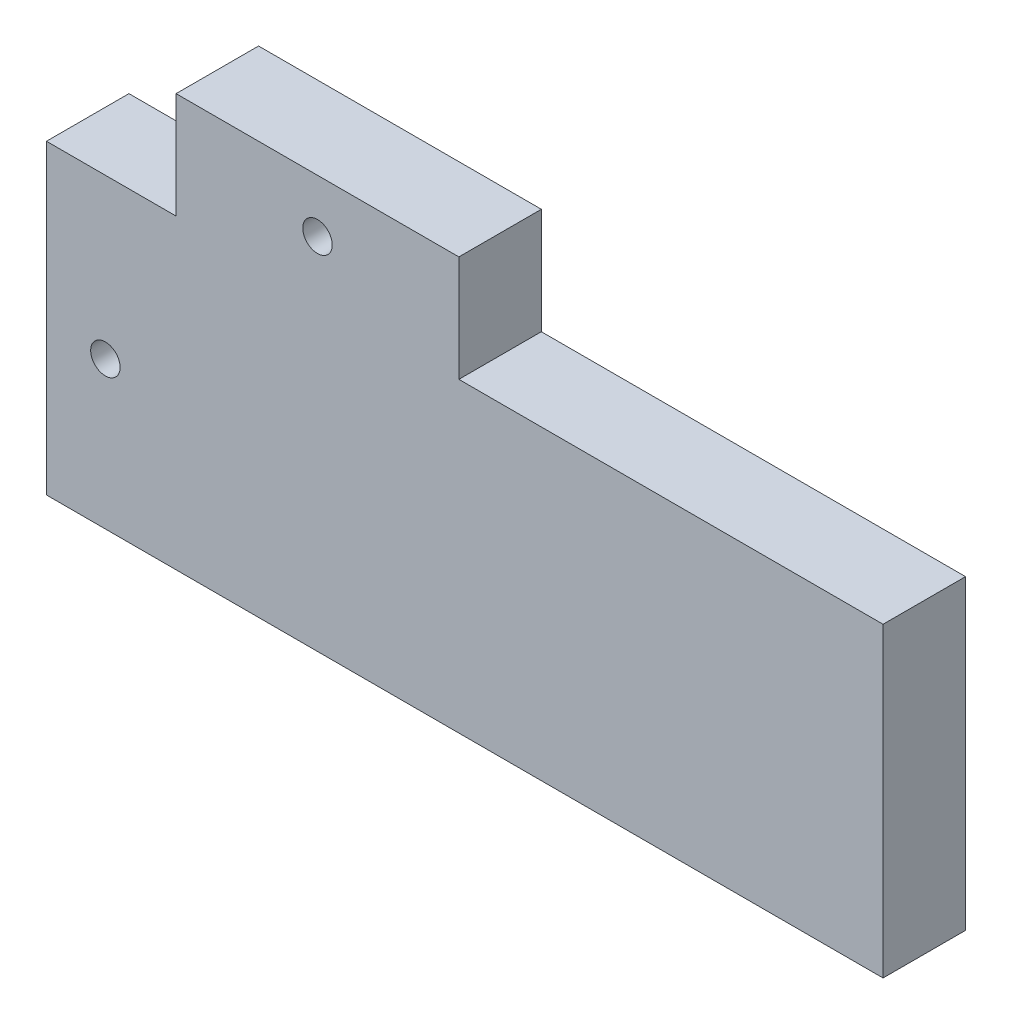
ISO-10303-21;
HEADER;
FILE_DESCRIPTION(('STEP AP214'),'2;1');
FILE_NAME('part.step','',(''),(''),'','','');
FILE_SCHEMA(('AUTOMOTIVE_DESIGN { 1 0 10303 214 1 1 1 1 }'));
ENDSEC;
DATA;
#1=APPLICATION_CONTEXT('core data for automotive mechanical design processes');
#2=APPLICATION_PROTOCOL_DEFINITION('international standard','automotive_design',2000,#1);
#3=PRODUCT_CONTEXT('',#1,'mechanical');
#4=PRODUCT('Part','Part','',(#3));
#5=PRODUCT_RELATED_PRODUCT_CATEGORY('part','',(#4));
#6=PRODUCT_DEFINITION_FORMATION('','',#4);
#7=PRODUCT_DEFINITION_CONTEXT('part definition',#1,'design');
#8=PRODUCT_DEFINITION('design','',#6,#7);
#9=PRODUCT_DEFINITION_SHAPE('','',#8);
#10=(LENGTH_UNIT() NAMED_UNIT(*) SI_UNIT(.MILLI.,.METRE.));
#11=(NAMED_UNIT(*) PLANE_ANGLE_UNIT() SI_UNIT($,.RADIAN.));
#12=(NAMED_UNIT(*) SI_UNIT($,.STERADIAN.) SOLID_ANGLE_UNIT());
#13=UNCERTAINTY_MEASURE_WITH_UNIT(LENGTH_MEASURE(1.E-05),#10,'distance_accuracy_value','');
#14=(GEOMETRIC_REPRESENTATION_CONTEXT(3) GLOBAL_UNCERTAINTY_ASSIGNED_CONTEXT((#13)) GLOBAL_UNIT_ASSIGNED_CONTEXT((#10,
#11,#12)) REPRESENTATION_CONTEXT('',''));
#15=CARTESIAN_POINT('',(0.,0.,0.));
#16=DIRECTION('',(0.,0.,1.));
#17=DIRECTION('',(1.,0.,0.));
#18=AXIS2_PLACEMENT_3D('',#15,#16,#17);
#19=CARTESIAN_POINT('',(0.,-13.,7.));
#20=DIRECTION('',(0.,1.,0.));
#21=DIRECTION('',(0.,0.,1.));
#22=AXIS2_PLACEMENT_3D('',#19,#20,#21);
#23=PLANE('',#22);
#24=DIRECTION('',(1.,0.,0.));
#25=VECTOR('',#24,1.);
#26=CARTESIAN_POINT('',(0.,-13.,0.));
#27=LINE('',#26,#25);
#28=CARTESIAN_POINT('',(-28.,-13.,0.));
#29=VERTEX_POINT('',#28);
#30=CARTESIAN_POINT('',(43.,-13.,0.));
#31=VERTEX_POINT('',#30);
#32=EDGE_CURVE('E149',#29,#31,#27,.T.);
#33=ORIENTED_EDGE('',*,*,#32,.T.);
#34=DIRECTION('',(0.,0.,-1.));
#35=VECTOR('',#34,1.);
#36=CARTESIAN_POINT('',(43.,-13.,7.));
#37=LINE('',#36,#35);
#38=CARTESIAN_POINT('',(43.,-13.,7.));
#39=VERTEX_POINT('',#38);
#40=EDGE_CURVE('E166',#39,#31,#37,.T.);
#41=ORIENTED_EDGE('',*,*,#40,.F.);
#42=DIRECTION('',(1.,0.,0.));
#43=VECTOR('',#42,1.);
#44=CARTESIAN_POINT('',(0.,-13.,7.));
#45=LINE('',#44,#43);
#46=CARTESIAN_POINT('',(-28.,-13.,7.));
#47=VERTEX_POINT('',#46);
#48=EDGE_CURVE('E124',#47,#39,#45,.T.);
#49=ORIENTED_EDGE('',*,*,#48,.F.);
#50=DIRECTION('',(0.,0.,-1.));
#51=VECTOR('',#50,1.);
#52=CARTESIAN_POINT('',(-28.,-13.,7.));
#53=LINE('',#52,#51);
#54=EDGE_CURVE('E51',#47,#29,#53,.T.);
#55=ORIENTED_EDGE('',*,*,#54,.T.);
#56=EDGE_LOOP('',(#33,#41,#49,#55));
#57=FACE_BOUND('',#56,.T.);
#58=ADVANCED_FACE('F35',(#57),#23,.F.);
#59=CARTESIAN_POINT('',(0.,13.,7.));
#60=DIRECTION('',(0.,1.,0.));
#61=DIRECTION('',(0.,0.,1.));
#62=AXIS2_PLACEMENT_3D('',#59,#60,#61);
#63=PLANE('',#62);
#64=DIRECTION('',(1.,0.,0.));
#65=VECTOR('',#64,1.);
#66=CARTESIAN_POINT('',(0.,13.,0.));
#67=LINE('',#66,#65);
#68=CARTESIAN_POINT('',(7.,13.,0.));
#69=VERTEX_POINT('',#68);
#70=CARTESIAN_POINT('',(43.,13.,0.));
#71=VERTEX_POINT('',#70);
#72=EDGE_CURVE('E180',#69,#71,#67,.T.);
#73=ORIENTED_EDGE('',*,*,#72,.F.);
#74=DIRECTION('',(0.,0.,-1.));
#75=VECTOR('',#74,1.);
#76=CARTESIAN_POINT('',(7.,13.,7.));
#77=LINE('',#76,#75);
#78=CARTESIAN_POINT('',(7.,13.,7.));
#79=VERTEX_POINT('',#78);
#80=EDGE_CURVE('E11',#79,#69,#77,.T.);
#81=ORIENTED_EDGE('',*,*,#80,.F.);
#82=DIRECTION('',(1.,0.,0.));
#83=VECTOR('',#82,1.);
#84=CARTESIAN_POINT('',(0.,13.,7.));
#85=LINE('',#84,#83);
#86=CARTESIAN_POINT('',(43.,13.,7.));
#87=VERTEX_POINT('',#86);
#88=EDGE_CURVE('E119',#79,#87,#85,.T.);
#89=ORIENTED_EDGE('',*,*,#88,.T.);
#90=DIRECTION('',(0.,0.,1.));
#91=VECTOR('',#90,1.);
#92=CARTESIAN_POINT('',(43.,13.,7.));
#93=LINE('',#92,#91);
#94=EDGE_CURVE('E154',#71,#87,#93,.T.);
#95=ORIENTED_EDGE('',*,*,#94,.F.);
#96=EDGE_LOOP('',(#73,#81,#89,#95));
#97=FACE_BOUND('',#96,.T.);
#98=ADVANCED_FACE('F211',(#97),#63,.T.);
#99=CARTESIAN_POINT('',(7.,0.,7.));
#100=DIRECTION('',(-1.,0.,0.));
#101=DIRECTION('',(0.,0.,1.));
#102=AXIS2_PLACEMENT_3D('',#99,#100,#101);
#103=PLANE('',#102);
#104=DIRECTION('',(0.,1.,0.));
#105=VECTOR('',#104,1.);
#106=CARTESIAN_POINT('',(7.,0.,0.));
#107=LINE('',#106,#105);
#108=CARTESIAN_POINT('',(7.,22.,0.));
#109=VERTEX_POINT('',#108);
#110=EDGE_CURVE('E183',#69,#109,#107,.T.);
#111=ORIENTED_EDGE('',*,*,#110,.T.);
#112=DIRECTION('',(0.,0.,-1.));
#113=VECTOR('',#112,1.);
#114=CARTESIAN_POINT('',(7.,22.,7.));
#115=LINE('',#114,#113);
#116=CARTESIAN_POINT('',(7.,22.,7.));
#117=VERTEX_POINT('',#116);
#118=EDGE_CURVE('E43',#117,#109,#115,.T.);
#119=ORIENTED_EDGE('',*,*,#118,.F.);
#120=DIRECTION('',(0.,1.,0.));
#121=VECTOR('',#120,1.);
#122=CARTESIAN_POINT('',(7.,0.,7.));
#123=LINE('',#122,#121);
#124=EDGE_CURVE('E123',#79,#117,#123,.T.);
#125=ORIENTED_EDGE('',*,*,#124,.F.);
#126=ORIENTED_EDGE('',*,*,#80,.T.);
#127=EDGE_LOOP('',(#111,#119,#125,#126));
#128=FACE_BOUND('',#127,.T.);
#129=ADVANCED_FACE('F199',(#128),#103,.F.);
#130=CARTESIAN_POINT('',(0.,22.,7.));
#131=DIRECTION('',(0.,1.,0.));
#132=DIRECTION('',(0.,0.,1.));
#133=AXIS2_PLACEMENT_3D('',#130,#131,#132);
#134=PLANE('',#133);
#135=DIRECTION('',(1.,0.,0.));
#136=VECTOR('',#135,1.);
#137=CARTESIAN_POINT('',(0.,22.,0.));
#138=LINE('',#137,#136);
#139=CARTESIAN_POINT('',(-17.,22.,0.));
#140=VERTEX_POINT('',#139);
#141=EDGE_CURVE('E188',#140,#109,#138,.T.);
#142=ORIENTED_EDGE('',*,*,#141,.F.);
#143=DIRECTION('',(0.,0.,-1.));
#144=VECTOR('',#143,1.);
#145=CARTESIAN_POINT('',(-17.,22.,7.));
#146=LINE('',#145,#144);
#147=CARTESIAN_POINT('',(-17.,22.,7.));
#148=VERTEX_POINT('',#147);
#149=EDGE_CURVE('E104',#148,#140,#146,.T.);
#150=ORIENTED_EDGE('',*,*,#149,.F.);
#151=DIRECTION('',(1.,0.,0.));
#152=VECTOR('',#151,1.);
#153=CARTESIAN_POINT('',(0.,22.,7.));
#154=LINE('',#153,#152);
#155=EDGE_CURVE('E114',#148,#117,#154,.T.);
#156=ORIENTED_EDGE('',*,*,#155,.T.);
#157=ORIENTED_EDGE('',*,*,#118,.T.);
#158=EDGE_LOOP('',(#142,#150,#156,#157));
#159=FACE_BOUND('',#158,.T.);
#160=ADVANCED_FACE('F197',(#159),#134,.T.);
#161=CARTESIAN_POINT('',(-17.,0.,7.));
#162=DIRECTION('',(-1.,0.,0.));
#163=DIRECTION('',(0.,0.,1.));
#164=AXIS2_PLACEMENT_3D('',#161,#162,#163);
#165=PLANE('',#164);
#166=DIRECTION('',(0.,1.,0.));
#167=VECTOR('',#166,1.);
#168=CARTESIAN_POINT('',(-17.,0.,0.));
#169=LINE('',#168,#167);
#170=CARTESIAN_POINT('',(-17.,13.,0.));
#171=VERTEX_POINT('',#170);
#172=EDGE_CURVE('E100',#171,#140,#169,.T.);
#173=ORIENTED_EDGE('',*,*,#172,.F.);
#174=DIRECTION('',(0.,0.,-1.));
#175=VECTOR('',#174,1.);
#176=CARTESIAN_POINT('',(-17.,13.,7.));
#177=LINE('',#176,#175);
#178=CARTESIAN_POINT('',(-17.,13.,7.));
#179=VERTEX_POINT('',#178);
#180=EDGE_CURVE('E95',#179,#171,#177,.T.);
#181=ORIENTED_EDGE('',*,*,#180,.F.);
#182=DIRECTION('',(0.,1.,0.));
#183=VECTOR('',#182,1.);
#184=CARTESIAN_POINT('',(-17.,0.,7.));
#185=LINE('',#184,#183);
#186=EDGE_CURVE('E98',#179,#148,#185,.T.);
#187=ORIENTED_EDGE('',*,*,#186,.T.);
#188=ORIENTED_EDGE('',*,*,#149,.T.);
#189=EDGE_LOOP('',(#173,#181,#187,#188));
#190=FACE_BOUND('',#189,.T.);
#191=ADVANCED_FACE('F97',(#190),#165,.T.);
#192=CARTESIAN_POINT('',(-28.,13.,0.));
#193=VERTEX_POINT('',#192);
#194=EDGE_CURVE('E133',#193,#171,#67,.T.);
#195=ORIENTED_EDGE('',*,*,#194,.F.);
#196=DIRECTION('',(0.,0.,-1.));
#197=VECTOR('',#196,1.);
#198=CARTESIAN_POINT('',(-28.,13.,7.));
#199=LINE('',#198,#197);
#200=CARTESIAN_POINT('',(-28.,13.,7.));
#201=VERTEX_POINT('',#200);
#202=EDGE_CURVE('E71',#201,#193,#199,.T.);
#203=ORIENTED_EDGE('',*,*,#202,.F.);
#204=EDGE_CURVE('E112',#201,#179,#85,.T.);
#205=ORIENTED_EDGE('',*,*,#204,.T.);
#206=ORIENTED_EDGE('',*,*,#180,.T.);
#207=EDGE_LOOP('',(#195,#203,#205,#206));
#208=FACE_BOUND('',#207,.T.);
#209=ADVANCED_FACE('F116',(#208),#63,.T.);
#210=CARTESIAN_POINT('',(-28.,0.,7.));
#211=DIRECTION('',(-1.,0.,0.));
#212=DIRECTION('',(0.,0.,1.));
#213=AXIS2_PLACEMENT_3D('',#210,#211,#212);
#214=PLANE('',#213);
#215=DIRECTION('',(0.,1.,0.));
#216=VECTOR('',#215,1.);
#217=CARTESIAN_POINT('',(-28.,0.,0.));
#218=LINE('',#217,#216);
#219=EDGE_CURVE('E128',#29,#193,#218,.T.);
#220=ORIENTED_EDGE('',*,*,#219,.F.);
#221=ORIENTED_EDGE('',*,*,#54,.F.);
#222=DIRECTION('',(0.,1.,0.));
#223=VECTOR('',#222,1.);
#224=CARTESIAN_POINT('',(-28.,0.,7.));
#225=LINE('',#224,#223);
#226=EDGE_CURVE('E117',#47,#201,#225,.T.);
#227=ORIENTED_EDGE('',*,*,#226,.T.);
#228=ORIENTED_EDGE('',*,*,#202,.T.);
#229=EDGE_LOOP('',(#220,#221,#227,#228));
#230=FACE_BOUND('',#229,.T.);
#231=ADVANCED_FACE('F201',(#230),#214,.T.);
#232=CARTESIAN_POINT('',(0.,0.,7.));
#233=DIRECTION('',(0.,0.,1.));
#234=DIRECTION('',(1.,0.,0.));
#235=AXIS2_PLACEMENT_3D('',#232,#233,#234);
#236=PLANE('',#235);
#237=CARTESIAN_POINT('',(-5.,17.5,7.));
#238=DIRECTION('',(0.,0.,1.));
#239=DIRECTION('',(1.,0.,0.));
#240=AXIS2_PLACEMENT_3D('',#237,#238,#239);
#241=CIRCLE('',#240,1.25);
#242=CARTESIAN_POINT('',(-3.75,17.5,7.));
#243=VERTEX_POINT('',#242);
#244=EDGE_CURVE('E143',#243,#243,#241,.T.);
#245=ORIENTED_EDGE('',*,*,#244,.F.);
#246=EDGE_LOOP('',(#245));
#247=FACE_BOUND('',#246,.T.);
#248=CARTESIAN_POINT('',(-23.,-0.5,7.));
#249=DIRECTION('',(0.,0.,1.));
#250=DIRECTION('',(1.,0.,0.));
#251=AXIS2_PLACEMENT_3D('',#248,#249,#250);
#252=CIRCLE('',#251,1.25);
#253=CARTESIAN_POINT('',(-21.75,-0.5,7.));
#254=VERTEX_POINT('',#253);
#255=EDGE_CURVE('E136',#254,#254,#252,.T.);
#256=ORIENTED_EDGE('',*,*,#255,.F.);
#257=EDGE_LOOP('',(#256));
#258=FACE_BOUND('',#257,.T.);
#259=ORIENTED_EDGE('',*,*,#48,.T.);
#260=DIRECTION('',(0.,-1.,0.));
#261=VECTOR('',#260,1.);
#262=CARTESIAN_POINT('',(43.,13.,7.));
#263=LINE('',#262,#261);
#264=EDGE_CURVE('E169',#87,#39,#263,.T.);
#265=ORIENTED_EDGE('',*,*,#264,.F.);
#266=ORIENTED_EDGE('',*,*,#88,.F.);
#267=ORIENTED_EDGE('',*,*,#124,.T.);
#268=ORIENTED_EDGE('',*,*,#155,.F.);
#269=ORIENTED_EDGE('',*,*,#186,.F.);
#270=ORIENTED_EDGE('',*,*,#204,.F.);
#271=ORIENTED_EDGE('',*,*,#226,.F.);
#272=EDGE_LOOP('',(#259,#265,#266,#267,#268,#269,#270,#271));
#273=FACE_BOUND('',#272,.T.);
#274=ADVANCED_FACE('F110',(#247,#258,#273),#236,.T.);
#275=CARTESIAN_POINT('',(0.,0.,0.));
#276=DIRECTION('',(0.,0.,1.));
#277=DIRECTION('',(1.,0.,0.));
#278=AXIS2_PLACEMENT_3D('',#275,#276,#277);
#279=PLANE('',#278);
#280=CARTESIAN_POINT('',(5.25,7.25,0.));
#281=DIRECTION('',(0.,0.,-1.));
#282=DIRECTION('',(-1.,0.,0.));
#283=AXIS2_PLACEMENT_3D('',#280,#281,#282);
#284=CIRCLE('',#283,2.65);
#285=CARTESIAN_POINT('',(2.6,7.25,0.));
#286=VERTEX_POINT('',#285);
#287=EDGE_CURVE('E157',#286,#286,#284,.T.);
#288=ORIENTED_EDGE('',*,*,#287,.F.);
#289=EDGE_LOOP('',(#288));
#290=FACE_BOUND('',#289,.T.);
#291=CARTESIAN_POINT('',(19.25,7.25,0.));
#292=DIRECTION('',(0.,0.,-1.));
#293=DIRECTION('',(-1.,0.,0.));
#294=AXIS2_PLACEMENT_3D('',#291,#292,#293);
#295=CIRCLE('',#294,2.65);
#296=CARTESIAN_POINT('',(16.6,7.25,0.));
#297=VERTEX_POINT('',#296);
#298=EDGE_CURVE('E150',#297,#297,#295,.T.);
#299=ORIENTED_EDGE('',*,*,#298,.F.);
#300=EDGE_LOOP('',(#299));
#301=FACE_BOUND('',#300,.T.);
#302=CARTESIAN_POINT('',(-5.,17.5,0.));
#303=DIRECTION('',(0.,0.,1.));
#304=DIRECTION('',(1.,0.,0.));
#305=AXIS2_PLACEMENT_3D('',#302,#303,#304);
#306=CIRCLE('',#305,1.25);
#307=CARTESIAN_POINT('',(-3.75,17.5,0.));
#308=VERTEX_POINT('',#307);
#309=EDGE_CURVE('E146',#308,#308,#306,.T.);
#310=ORIENTED_EDGE('',*,*,#309,.T.);
#311=EDGE_LOOP('',(#310));
#312=FACE_BOUND('',#311,.T.);
#313=CARTESIAN_POINT('',(-23.,-0.5,0.));
#314=DIRECTION('',(0.,0.,1.));
#315=DIRECTION('',(1.,0.,0.));
#316=AXIS2_PLACEMENT_3D('',#313,#314,#315);
#317=CIRCLE('',#316,1.25);
#318=CARTESIAN_POINT('',(-21.75,-0.5,0.));
#319=VERTEX_POINT('',#318);
#320=EDGE_CURVE('E139',#319,#319,#317,.T.);
#321=ORIENTED_EDGE('',*,*,#320,.T.);
#322=EDGE_LOOP('',(#321));
#323=FACE_BOUND('',#322,.T.);
#324=ORIENTED_EDGE('',*,*,#32,.F.);
#325=ORIENTED_EDGE('',*,*,#219,.T.);
#326=ORIENTED_EDGE('',*,*,#194,.T.);
#327=ORIENTED_EDGE('',*,*,#172,.T.);
#328=ORIENTED_EDGE('',*,*,#141,.T.);
#329=ORIENTED_EDGE('',*,*,#110,.F.);
#330=ORIENTED_EDGE('',*,*,#72,.T.);
#331=DIRECTION('',(0.,1.,0.));
#332=VECTOR('',#331,1.);
#333=CARTESIAN_POINT('',(43.,13.,0.));
#334=LINE('',#333,#332);
#335=EDGE_CURVE('E163',#31,#71,#334,.T.);
#336=ORIENTED_EDGE('',*,*,#335,.F.);
#337=EDGE_LOOP('',(#324,#325,#326,#327,#328,#329,#330,#336));
#338=FACE_BOUND('',#337,.T.);
#339=ADVANCED_FACE('F200',(#290,#301,#312,#323,#338),#279,.F.);
#340=CARTESIAN_POINT('',(-23.,-0.5,0.));
#341=DIRECTION('',(0.,0.,1.));
#342=DIRECTION('',(1.,0.,0.));
#343=AXIS2_PLACEMENT_3D('',#340,#341,#342);
#344=CYLINDRICAL_SURFACE('',#343,1.25);
#345=ORIENTED_EDGE('',*,*,#320,.F.);
#346=EDGE_LOOP('',(#345));
#347=FACE_BOUND('',#346,.T.);
#348=ORIENTED_EDGE('',*,*,#255,.T.);
#349=EDGE_LOOP('',(#348));
#350=FACE_BOUND('',#349,.T.);
#351=ADVANCED_FACE('F247',(#347,#350),#344,.F.);
#352=CARTESIAN_POINT('',(-5.,17.5,0.));
#353=DIRECTION('',(0.,0.,1.));
#354=DIRECTION('',(1.,0.,0.));
#355=AXIS2_PLACEMENT_3D('',#352,#353,#354);
#356=CYLINDRICAL_SURFACE('',#355,1.25);
#357=ORIENTED_EDGE('',*,*,#309,.F.);
#358=EDGE_LOOP('',(#357));
#359=FACE_BOUND('',#358,.T.);
#360=ORIENTED_EDGE('',*,*,#244,.T.);
#361=EDGE_LOOP('',(#360));
#362=FACE_BOUND('',#361,.T.);
#363=ADVANCED_FACE('F252',(#359,#362),#356,.F.);
#364=CARTESIAN_POINT('',(19.25,7.25,4.6));
#365=DIRECTION('',(0.,0.,-1.));
#366=DIRECTION('',(-1.,0.,0.));
#367=AXIS2_PLACEMENT_3D('',#364,#365,#366);
#368=CYLINDRICAL_SURFACE('',#367,2.65);
#369=CARTESIAN_POINT('',(19.25,7.25,4.6));
#370=DIRECTION('',(0.,0.,-1.));
#371=DIRECTION('',(-1.,0.,0.));
#372=AXIS2_PLACEMENT_3D('',#369,#370,#371);
#373=CIRCLE('',#372,2.65);
#374=CARTESIAN_POINT('',(16.6,7.25,4.6));
#375=VERTEX_POINT('',#374);
#376=EDGE_CURVE('E153',#375,#375,#373,.T.);
#377=ORIENTED_EDGE('',*,*,#376,.F.);
#378=EDGE_LOOP('',(#377));
#379=FACE_BOUND('',#378,.T.);
#380=ORIENTED_EDGE('',*,*,#298,.T.);
#381=EDGE_LOOP('',(#380));
#382=FACE_BOUND('',#381,.T.);
#383=ADVANCED_FACE('F264',(#379,#382),#368,.F.);
#384=CARTESIAN_POINT('',(19.25,7.25,4.6));
#385=DIRECTION('',(0.,0.,-1.));
#386=DIRECTION('',(-1.,0.,0.));
#387=AXIS2_PLACEMENT_3D('',#384,#385,#386);
#388=PLANE('',#387);
#389=ORIENTED_EDGE('',*,*,#376,.T.);
#390=EDGE_LOOP('',(#389));
#391=FACE_BOUND('',#390,.T.);
#392=ADVANCED_FACE('F274',(#391),#388,.T.);
#393=CARTESIAN_POINT('',(5.25,7.25,4.6));
#394=DIRECTION('',(0.,0.,-1.));
#395=DIRECTION('',(-1.,0.,0.));
#396=AXIS2_PLACEMENT_3D('',#393,#394,#395);
#397=CYLINDRICAL_SURFACE('',#396,2.65);
#398=CARTESIAN_POINT('',(5.25,7.25,4.6));
#399=DIRECTION('',(0.,0.,-1.));
#400=DIRECTION('',(-1.,0.,0.));
#401=AXIS2_PLACEMENT_3D('',#398,#399,#400);
#402=CIRCLE('',#401,2.65);
#403=CARTESIAN_POINT('',(2.6,7.25,4.6));
#404=VERTEX_POINT('',#403);
#405=EDGE_CURVE('E140',#404,#404,#402,.T.);
#406=ORIENTED_EDGE('',*,*,#405,.F.);
#407=EDGE_LOOP('',(#406));
#408=FACE_BOUND('',#407,.T.);
#409=ORIENTED_EDGE('',*,*,#287,.T.);
#410=EDGE_LOOP('',(#409));
#411=FACE_BOUND('',#410,.T.);
#412=ADVANCED_FACE('F284',(#408,#411),#397,.F.);
#413=CARTESIAN_POINT('',(5.25,7.25,4.6));
#414=DIRECTION('',(0.,0.,-1.));
#415=DIRECTION('',(-1.,0.,0.));
#416=AXIS2_PLACEMENT_3D('',#413,#414,#415);
#417=PLANE('',#416);
#418=ORIENTED_EDGE('',*,*,#405,.T.);
#419=EDGE_LOOP('',(#418));
#420=FACE_BOUND('',#419,.T.);
#421=ADVANCED_FACE('F294',(#420),#417,.T.);
#422=CARTESIAN_POINT('',(43.,0.,0.));
#423=DIRECTION('',(1.,0.,0.));
#424=DIRECTION('',(0.,0.,-1.));
#425=AXIS2_PLACEMENT_3D('',#422,#423,#424);
#426=PLANE('',#425);
#427=ORIENTED_EDGE('',*,*,#264,.T.);
#428=ORIENTED_EDGE('',*,*,#40,.T.);
#429=ORIENTED_EDGE('',*,*,#335,.T.);
#430=ORIENTED_EDGE('',*,*,#94,.T.);
#431=EDGE_LOOP('',(#427,#428,#429,#430));
#432=FACE_BOUND('',#431,.T.);
#433=ADVANCED_FACE('F172',(#432),#426,.T.);
#434=CLOSED_SHELL('',(#58,#98,#129,#160,#191,#209,#231,#274,#339,#351,#363,#383,#392,#412,#421,#433));
#435=MANIFOLD_SOLID_BREP('B2',#434);
#436=ADVANCED_BREP_SHAPE_REPRESENTATION('',(#18,#435),#14);
#437=SHAPE_DEFINITION_REPRESENTATION(#9,#436);
ENDSEC;
END-ISO-10303-21;
